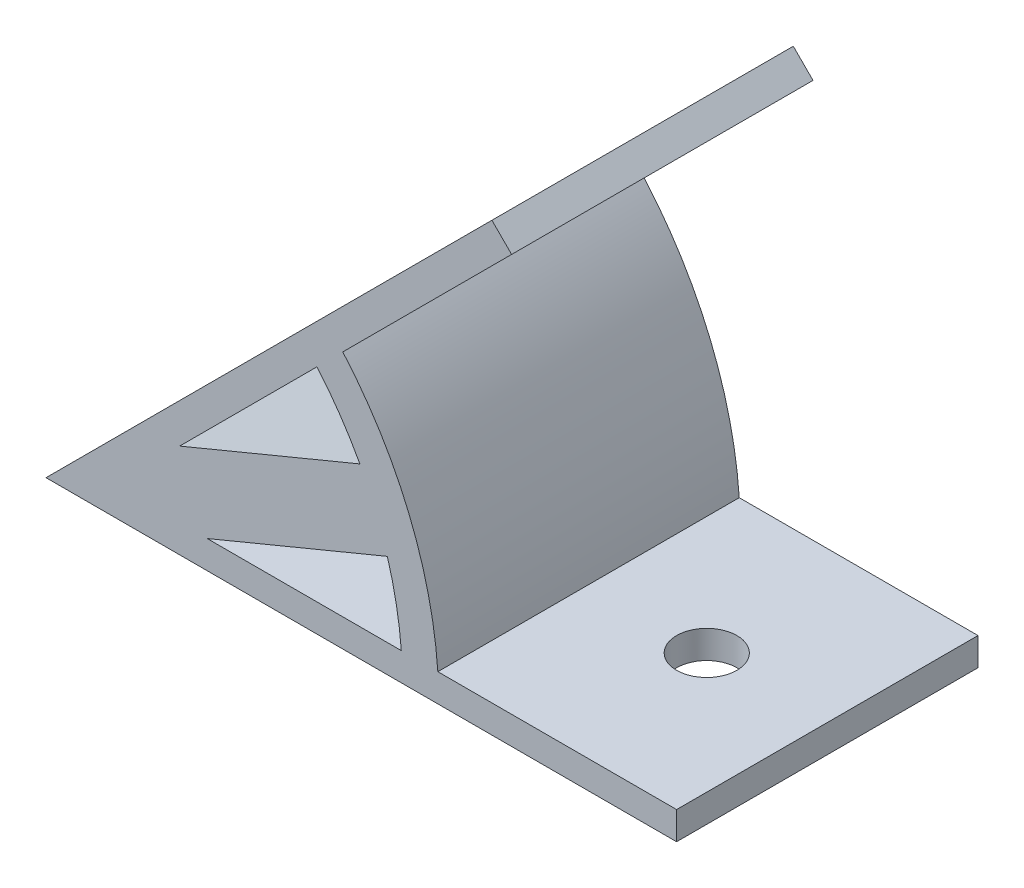
ISO-10303-21;
HEADER;
FILE_DESCRIPTION(('STEP AP214'),'2;1');
FILE_NAME('part.step','',(''),(''),'','','');
FILE_SCHEMA(('AUTOMOTIVE_DESIGN { 1 0 10303 214 1 1 1 1 }'));
ENDSEC;
DATA;
#1=APPLICATION_CONTEXT('core data for automotive mechanical design processes');
#2=APPLICATION_PROTOCOL_DEFINITION('international standard','automotive_design',2000,#1);
#3=PRODUCT_CONTEXT('',#1,'mechanical');
#4=PRODUCT('Part','Part','',(#3));
#5=PRODUCT_RELATED_PRODUCT_CATEGORY('part','',(#4));
#6=PRODUCT_DEFINITION_FORMATION('','',#4);
#7=PRODUCT_DEFINITION_CONTEXT('part definition',#1,'design');
#8=PRODUCT_DEFINITION('design','',#6,#7);
#9=PRODUCT_DEFINITION_SHAPE('','',#8);
#10=(LENGTH_UNIT() NAMED_UNIT(*) SI_UNIT(.MILLI.,.METRE.));
#11=(NAMED_UNIT(*) PLANE_ANGLE_UNIT() SI_UNIT($,.RADIAN.));
#12=(NAMED_UNIT(*) SI_UNIT($,.STERADIAN.) SOLID_ANGLE_UNIT());
#13=UNCERTAINTY_MEASURE_WITH_UNIT(LENGTH_MEASURE(1.E-05),#10,'distance_accuracy_value','');
#14=(GEOMETRIC_REPRESENTATION_CONTEXT(3) GLOBAL_UNCERTAINTY_ASSIGNED_CONTEXT((#13)) GLOBAL_UNIT_ASSIGNED_CONTEXT((#10,
#11,#12)) REPRESENTATION_CONTEXT('',''));
#15=CARTESIAN_POINT('',(0.,0.,0.));
#16=DIRECTION('',(0.,0.,1.));
#17=DIRECTION('',(1.,0.,0.));
#18=AXIS2_PLACEMENT_3D('',#15,#16,#17);
#19=CARTESIAN_POINT('',(0.,0.,25.));
#20=DIRECTION('',(0.,0.,1.));
#21=DIRECTION('',(1.,0.,0.));
#22=AXIS2_PLACEMENT_3D('',#19,#20,#21);
#23=PLANE('',#22);
#24=DIRECTION('',(-0.707106781186547,-0.707106781186548,0.));
#25=VECTOR('',#24,1.);
#26=CARTESIAN_POINT('',(0.,0.,25.));
#27=LINE('',#26,#25);
#28=CARTESIAN_POINT('',(36.9856111019384,36.9856111019385,25.));
#29=VERTEX_POINT('',#28);
#30=CARTESIAN_POINT('',(0.,0.,25.));
#31=VERTEX_POINT('',#30);
#32=EDGE_CURVE('E183',#29,#31,#27,.T.);
#33=ORIENTED_EDGE('',*,*,#32,.T.);
#34=DIRECTION('',(1.,0.,0.));
#35=VECTOR('',#34,1.);
#36=CARTESIAN_POINT('',(0.,0.,25.));
#37=LINE('',#36,#35);
#38=CARTESIAN_POINT('',(52.3055528330183,0.,25.));
#39=VERTEX_POINT('',#38);
#40=EDGE_CURVE('E186',#31,#39,#37,.T.);
#41=ORIENTED_EDGE('',*,*,#40,.T.);
#42=DIRECTION('',(0.,1.,0.));
#43=VECTOR('',#42,1.);
#44=CARTESIAN_POINT('',(52.3055528330183,0.,25.));
#45=LINE('',#44,#43);
#46=CARTESIAN_POINT('',(52.3055528330183,2.31452320854952,25.));
#47=VERTEX_POINT('',#46);
#48=EDGE_CURVE('E189',#39,#47,#45,.T.);
#49=ORIENTED_EDGE('',*,*,#48,.T.);
#50=DIRECTION('',(-1.,0.,0.));
#51=VECTOR('',#50,1.);
#52=CARTESIAN_POINT('',(52.3055528330183,2.31452320854952,25.));
#53=LINE('',#52,#51);
#54=CARTESIAN_POINT('',(32.5014490935283,2.31452320854952,25.));
#55=VERTEX_POINT('',#54);
#56=EDGE_CURVE('E191',#47,#55,#53,.T.);
#57=ORIENTED_EDGE('',*,*,#56,.T.);
#58=CARTESIAN_POINT('',(0.,0.,25.));
#59=DIRECTION('',(0.,0.,1.));
#60=DIRECTION('',(1.,0.,0.));
#61=AXIS2_PLACEMENT_3D('',#58,#59,#60);
#62=CIRCLE('',#61,32.5837568561719);
#63=CARTESIAN_POINT('',(24.6186101084022,21.3453799964443,25.));
#64=VERTEX_POINT('',#63);
#65=EDGE_CURVE('E193',#55,#64,#62,.T.);
#66=ORIENTED_EDGE('',*,*,#65,.T.);
#67=DIRECTION('',(0.707106781186547,0.707106781186548,0.));
#68=VECTOR('',#67,1.);
#69=CARTESIAN_POINT('',(38.6222261579174,35.3489960459595,25.));
#70=LINE('',#69,#68);
#71=CARTESIAN_POINT('',(38.6222261579174,35.3489960459595,25.));
#72=VERTEX_POINT('',#71);
#73=EDGE_CURVE('E195',#64,#72,#70,.T.);
#74=ORIENTED_EDGE('',*,*,#73,.T.);
#75=DIRECTION('',(-0.707106781186549,0.707106781186546,0.));
#76=VECTOR('',#75,1.);
#77=CARTESIAN_POINT('',(36.9856111019384,36.9856111019385,25.));
#78=LINE('',#77,#76);
#79=EDGE_CURVE('E197',#72,#29,#78,.T.);
#80=ORIENTED_EDGE('',*,*,#79,.T.);
#81=EDGE_LOOP('',(#33,#41,#49,#57,#66,#74,#80));
#82=FACE_BOUND('',#81,.T.);
#83=DIRECTION('',(0.923879532511287,0.38268343236509,0.));
#84=VECTOR('',#83,1.);
#85=CARTESIAN_POINT('',(11.0897214732478,7.8164913612898,25.));
#86=LINE('',#85,#84);
#87=CARTESIAN_POINT('',(11.0897214732478,7.8164913612898,25.));
#88=VERTEX_POINT('',#87);
#89=CARTESIAN_POINT('',(26.0330794630544,14.006232908064,25.));
#90=VERTEX_POINT('',#89);
#91=EDGE_CURVE('E161',#88,#90,#86,.T.);
#92=ORIENTED_EDGE('',*,*,#91,.F.);
#93=DIRECTION('',(-0.707106781186547,-0.707106781186548,0.));
#94=VECTOR('',#93,1.);
#95=CARTESIAN_POINT('',(22.4757461429716,19.2025160310136,25.));
#96=LINE('',#95,#94);
#97=CARTESIAN_POINT('',(22.4757461429716,19.2025160310136,25.));
#98=VERTEX_POINT('',#97);
#99=EDGE_CURVE('E159',#98,#88,#96,.T.);
#100=ORIENTED_EDGE('',*,*,#99,.F.);
#101=CARTESIAN_POINT('',(0.,0.,25.));
#102=DIRECTION('',(0.,0.,1.));
#103=DIRECTION('',(-1.,0.,0.));
#104=AXIS2_PLACEMENT_3D('',#101,#102,#103);
#105=CIRCLE('',#104,29.5617284103051);
#106=EDGE_CURVE('E165',#90,#98,#105,.T.);
#107=ORIENTED_EDGE('',*,*,#106,.F.);
#108=EDGE_LOOP('',(#92,#100,#107));
#109=FACE_BOUND('',#108,.T.);
#110=DIRECTION('',(-0.923879532511287,-0.38268343236509,0.));
#111=VECTOR('',#110,1.);
#112=CARTESIAN_POINT('',(13.3687113018577,2.31452320854952,25.));
#113=LINE('',#112,#111);
#114=CARTESIAN_POINT('',(28.3120692916643,8.50426475532377,25.));
#115=VERTEX_POINT('',#114);
#116=CARTESIAN_POINT('',(13.3687113018577,2.31452320854952,25.));
#117=VERTEX_POINT('',#116);
#118=EDGE_CURVE('E138',#115,#117,#113,.T.);
#119=ORIENTED_EDGE('',*,*,#118,.F.);
#120=CARTESIAN_POINT('',(0.,0.,25.));
#121=DIRECTION('',(0.,0.,1.));
#122=DIRECTION('',(1.,0.,0.));
#123=AXIS2_PLACEMENT_3D('',#120,#121,#122);
#124=CIRCLE('',#123,29.5617284103051);
#125=CARTESIAN_POINT('',(29.4709818112958,2.31452320854952,25.));
#126=VERTEX_POINT('',#125);
#127=EDGE_CURVE('E130',#126,#115,#124,.T.);
#128=ORIENTED_EDGE('',*,*,#127,.F.);
#129=DIRECTION('',(1.,0.,0.));
#130=VECTOR('',#129,1.);
#131=CARTESIAN_POINT('',(29.4709818112958,2.31452320854952,25.));
#132=LINE('',#131,#130);
#133=EDGE_CURVE('E147',#117,#126,#132,.T.);
#134=ORIENTED_EDGE('',*,*,#133,.F.);
#135=EDGE_LOOP('',(#119,#128,#134));
#136=FACE_BOUND('',#135,.T.);
#137=ADVANCED_FACE('F33',(#82,#109,#136),#23,.T.);
#138=CARTESIAN_POINT('',(0.,0.,0.));
#139=DIRECTION('',(0.,0.,1.));
#140=DIRECTION('',(1.,0.,0.));
#141=AXIS2_PLACEMENT_3D('',#138,#139,#140);
#142=PLANE('',#141);
#143=DIRECTION('',(-0.707106781186547,-0.707106781186548,0.));
#144=VECTOR('',#143,1.);
#145=CARTESIAN_POINT('',(22.4757461429716,19.2025160310136,0.));
#146=LINE('',#145,#144);
#147=CARTESIAN_POINT('',(22.4757461429716,19.2025160310136,0.));
#148=VERTEX_POINT('',#147);
#149=CARTESIAN_POINT('',(11.0897214732478,7.8164913612898,0.));
#150=VERTEX_POINT('',#149);
#151=EDGE_CURVE('E145',#148,#150,#146,.T.);
#152=ORIENTED_EDGE('',*,*,#151,.T.);
#153=DIRECTION('',(0.923879532511287,0.38268343236509,0.));
#154=VECTOR('',#153,1.);
#155=CARTESIAN_POINT('',(11.0897214732478,7.8164913612898,0.));
#156=LINE('',#155,#154);
#157=CARTESIAN_POINT('',(26.0330794630544,14.006232908064,0.));
#158=VERTEX_POINT('',#157);
#159=EDGE_CURVE('E170',#150,#158,#156,.T.);
#160=ORIENTED_EDGE('',*,*,#159,.T.);
#161=CARTESIAN_POINT('',(0.,0.,0.));
#162=DIRECTION('',(0.,0.,1.));
#163=DIRECTION('',(-1.,0.,0.));
#164=AXIS2_PLACEMENT_3D('',#161,#162,#163);
#165=CIRCLE('',#164,29.5617284103051);
#166=EDGE_CURVE('E162',#158,#148,#165,.T.);
#167=ORIENTED_EDGE('',*,*,#166,.T.);
#168=EDGE_LOOP('',(#152,#160,#167));
#169=FACE_BOUND('',#168,.T.);
#170=DIRECTION('',(-0.707106781186547,-0.707106781186548,0.));
#171=VECTOR('',#170,1.);
#172=CARTESIAN_POINT('',(0.,0.,0.));
#173=LINE('',#172,#171);
#174=CARTESIAN_POINT('',(36.9856111019384,36.9856111019385,0.));
#175=VERTEX_POINT('',#174);
#176=CARTESIAN_POINT('',(0.,0.,0.));
#177=VERTEX_POINT('',#176);
#178=EDGE_CURVE('E182',#175,#177,#173,.T.);
#179=ORIENTED_EDGE('',*,*,#178,.F.);
#180=DIRECTION('',(-0.707106781186549,0.707106781186546,0.));
#181=VECTOR('',#180,1.);
#182=CARTESIAN_POINT('',(36.9856111019384,36.9856111019385,0.));
#183=LINE('',#182,#181);
#184=CARTESIAN_POINT('',(38.6222261579174,35.3489960459595,0.));
#185=VERTEX_POINT('',#184);
#186=EDGE_CURVE('E187',#185,#175,#183,.T.);
#187=ORIENTED_EDGE('',*,*,#186,.F.);
#188=DIRECTION('',(0.707106781186547,0.707106781186548,0.));
#189=VECTOR('',#188,1.);
#190=CARTESIAN_POINT('',(38.6222261579174,35.3489960459595,0.));
#191=LINE('',#190,#189);
#192=CARTESIAN_POINT('',(24.6186101084022,21.3453799964443,0.));
#193=VERTEX_POINT('',#192);
#194=EDGE_CURVE('E210',#193,#185,#191,.T.);
#195=ORIENTED_EDGE('',*,*,#194,.F.);
#196=CARTESIAN_POINT('',(0.,0.,0.));
#197=DIRECTION('',(0.,0.,1.));
#198=DIRECTION('',(1.,0.,0.));
#199=AXIS2_PLACEMENT_3D('',#196,#197,#198);
#200=CIRCLE('',#199,32.5837568561719);
#201=CARTESIAN_POINT('',(32.5014490935283,2.31452320854952,0.));
#202=VERTEX_POINT('',#201);
#203=EDGE_CURVE('E208',#202,#193,#200,.T.);
#204=ORIENTED_EDGE('',*,*,#203,.F.);
#205=DIRECTION('',(-1.,0.,0.));
#206=VECTOR('',#205,1.);
#207=CARTESIAN_POINT('',(52.3055528330183,2.31452320854952,0.));
#208=LINE('',#207,#206);
#209=CARTESIAN_POINT('',(52.3055528330183,2.31452320854952,0.));
#210=VERTEX_POINT('',#209);
#211=EDGE_CURVE('E206',#210,#202,#208,.T.);
#212=ORIENTED_EDGE('',*,*,#211,.F.);
#213=DIRECTION('',(0.,1.,0.));
#214=VECTOR('',#213,1.);
#215=CARTESIAN_POINT('',(52.3055528330183,0.,0.));
#216=LINE('',#215,#214);
#217=CARTESIAN_POINT('',(52.3055528330183,0.,0.));
#218=VERTEX_POINT('',#217);
#219=EDGE_CURVE('E204',#218,#210,#216,.T.);
#220=ORIENTED_EDGE('',*,*,#219,.F.);
#221=DIRECTION('',(1.,0.,0.));
#222=VECTOR('',#221,1.);
#223=CARTESIAN_POINT('',(0.,0.,0.));
#224=LINE('',#223,#222);
#225=EDGE_CURVE('E202',#177,#218,#224,.T.);
#226=ORIENTED_EDGE('',*,*,#225,.F.);
#227=EDGE_LOOP('',(#179,#187,#195,#204,#212,#220,#226));
#228=FACE_BOUND('',#227,.T.);
#229=CARTESIAN_POINT('',(0.,0.,0.));
#230=DIRECTION('',(0.,0.,1.));
#231=DIRECTION('',(1.,0.,0.));
#232=AXIS2_PLACEMENT_3D('',#229,#230,#231);
#233=CIRCLE('',#232,29.5617284103051);
#234=CARTESIAN_POINT('',(29.4709818112958,2.31452320854952,0.));
#235=VERTEX_POINT('',#234);
#236=CARTESIAN_POINT('',(28.3120692916643,8.50426475532377,0.));
#237=VERTEX_POINT('',#236);
#238=EDGE_CURVE('E58',#235,#237,#233,.T.);
#239=ORIENTED_EDGE('',*,*,#238,.T.);
#240=DIRECTION('',(-0.923879532511287,-0.38268343236509,0.));
#241=VECTOR('',#240,1.);
#242=CARTESIAN_POINT('',(13.3687113018577,2.31452320854952,0.));
#243=LINE('',#242,#241);
#244=CARTESIAN_POINT('',(13.3687113018577,2.31452320854952,0.));
#245=VERTEX_POINT('',#244);
#246=EDGE_CURVE('E144',#237,#245,#243,.T.);
#247=ORIENTED_EDGE('',*,*,#246,.T.);
#248=DIRECTION('',(1.,0.,0.));
#249=VECTOR('',#248,1.);
#250=CARTESIAN_POINT('',(29.4709818112958,2.31452320854952,0.));
#251=LINE('',#250,#249);
#252=EDGE_CURVE('E139',#245,#235,#251,.T.);
#253=ORIENTED_EDGE('',*,*,#252,.T.);
#254=EDGE_LOOP('',(#239,#247,#253));
#255=FACE_BOUND('',#254,.T.);
#256=ADVANCED_FACE('F247',(#169,#228,#255),#142,.F.);
#257=CARTESIAN_POINT('',(0.,0.,25.));
#258=DIRECTION('',(0.707106781186548,-0.707106781186547,0.));
#259=DIRECTION('',(0.707106781186547,0.707106781186548,0.));
#260=AXIS2_PLACEMENT_3D('',#257,#258,#259);
#261=PLANE('',#260);
#262=CARTESIAN_POINT('',(29.914543290073,29.914543290073,12.5));
#263=DIRECTION('',(-0.707106781186548,0.707106781186547,0.));
#264=DIRECTION('',(-0.707106781186547,-0.707106781186548,0.));
#265=AXIS2_PLACEMENT_3D('',#262,#263,#264);
#266=CIRCLE('',#265,2.5);
#267=CARTESIAN_POINT('',(28.1467763371066,28.1467763371066,12.5));
#268=VERTEX_POINT('',#267);
#269=EDGE_CURVE('E236',#268,#268,#266,.T.);
#270=ORIENTED_EDGE('',*,*,#269,.F.);
#271=EDGE_LOOP('',(#270));
#272=FACE_BOUND('',#271,.T.);
#273=ORIENTED_EDGE('',*,*,#178,.T.);
#274=DIRECTION('',(0.,0.,-1.));
#275=VECTOR('',#274,1.);
#276=CARTESIAN_POINT('',(0.,0.,25.));
#277=LINE('',#276,#275);
#278=EDGE_CURVE('E11',#31,#177,#277,.T.);
#279=ORIENTED_EDGE('',*,*,#278,.F.);
#280=ORIENTED_EDGE('',*,*,#32,.F.);
#281=DIRECTION('',(0.,0.,-1.));
#282=VECTOR('',#281,1.);
#283=CARTESIAN_POINT('',(36.9856111019384,36.9856111019385,25.));
#284=LINE('',#283,#282);
#285=EDGE_CURVE('E199',#29,#175,#284,.T.);
#286=ORIENTED_EDGE('',*,*,#285,.T.);
#287=EDGE_LOOP('',(#273,#279,#280,#286));
#288=FACE_BOUND('',#287,.T.);
#289=ADVANCED_FACE('F35',(#272,#288),#261,.F.);
#290=CARTESIAN_POINT('',(0.,0.,25.));
#291=DIRECTION('',(0.,1.,0.));
#292=DIRECTION('',(-1.,0.,0.));
#293=AXIS2_PLACEMENT_3D('',#290,#291,#292);
#294=PLANE('',#293);
#295=CARTESIAN_POINT('',(42.3055528330183,0.,12.5));
#296=DIRECTION('',(0.,-1.,0.));
#297=DIRECTION('',(1.,0.,0.));
#298=AXIS2_PLACEMENT_3D('',#295,#296,#297);
#299=CIRCLE('',#298,2.5);
#300=CARTESIAN_POINT('',(44.8055528330183,0.,12.5));
#301=VERTEX_POINT('',#300);
#302=EDGE_CURVE('E229',#301,#301,#299,.T.);
#303=ORIENTED_EDGE('',*,*,#302,.F.);
#304=EDGE_LOOP('',(#303));
#305=FACE_BOUND('',#304,.T.);
#306=ORIENTED_EDGE('',*,*,#225,.T.);
#307=DIRECTION('',(0.,0.,-1.));
#308=VECTOR('',#307,1.);
#309=CARTESIAN_POINT('',(52.3055528330183,0.,25.));
#310=LINE('',#309,#308);
#311=EDGE_CURVE('E42',#39,#218,#310,.T.);
#312=ORIENTED_EDGE('',*,*,#311,.F.);
#313=ORIENTED_EDGE('',*,*,#40,.F.);
#314=ORIENTED_EDGE('',*,*,#278,.T.);
#315=EDGE_LOOP('',(#306,#312,#313,#314));
#316=FACE_BOUND('',#315,.T.);
#317=ADVANCED_FACE('F246',(#305,#316),#294,.F.);
#318=CARTESIAN_POINT('',(52.3055528330183,0.,25.));
#319=DIRECTION('',(-1.,0.,0.));
#320=DIRECTION('',(0.,0.,1.));
#321=AXIS2_PLACEMENT_3D('',#318,#319,#320);
#322=PLANE('',#321);
#323=ORIENTED_EDGE('',*,*,#219,.T.);
#324=DIRECTION('',(0.,0.,-1.));
#325=VECTOR('',#324,1.);
#326=CARTESIAN_POINT('',(52.3055528330183,2.31452320854952,25.));
#327=LINE('',#326,#325);
#328=EDGE_CURVE('E224',#47,#210,#327,.T.);
#329=ORIENTED_EDGE('',*,*,#328,.F.);
#330=ORIENTED_EDGE('',*,*,#48,.F.);
#331=ORIENTED_EDGE('',*,*,#311,.T.);
#332=EDGE_LOOP('',(#323,#329,#330,#331));
#333=FACE_BOUND('',#332,.T.);
#334=ADVANCED_FACE('F281',(#333),#322,.F.);
#335=CARTESIAN_POINT('',(52.3055528330183,2.31452320854952,25.));
#336=DIRECTION('',(0.,-1.,0.));
#337=DIRECTION('',(0.,0.,-1.));
#338=AXIS2_PLACEMENT_3D('',#335,#336,#337);
#339=PLANE('',#338);
#340=CARTESIAN_POINT('',(42.3055528330183,2.31452320854952,12.5));
#341=DIRECTION('',(0.,-1.,0.));
#342=DIRECTION('',(0.,0.,-1.));
#343=AXIS2_PLACEMENT_3D('',#340,#341,#342);
#344=CIRCLE('',#343,2.5);
#345=CARTESIAN_POINT('',(42.3055528330183,2.31452320854952,10.));
#346=VERTEX_POINT('',#345);
#347=EDGE_CURVE('E153',#346,#346,#344,.T.);
#348=ORIENTED_EDGE('',*,*,#347,.T.);
#349=EDGE_LOOP('',(#348));
#350=FACE_BOUND('',#349,.T.);
#351=ORIENTED_EDGE('',*,*,#211,.T.);
#352=DIRECTION('',(0.,0.,-1.));
#353=VECTOR('',#352,1.);
#354=CARTESIAN_POINT('',(32.5014490935283,2.31452320854952,25.));
#355=LINE('',#354,#353);
#356=EDGE_CURVE('E221',#55,#202,#355,.T.);
#357=ORIENTED_EDGE('',*,*,#356,.F.);
#358=ORIENTED_EDGE('',*,*,#56,.F.);
#359=ORIENTED_EDGE('',*,*,#328,.T.);
#360=EDGE_LOOP('',(#351,#357,#358,#359));
#361=FACE_BOUND('',#360,.T.);
#362=ADVANCED_FACE('F278',(#350,#361),#339,.F.);
#363=CARTESIAN_POINT('',(0.,0.,25.));
#364=DIRECTION('',(0.,0.,-1.));
#365=DIRECTION('',(-1.,0.,0.));
#366=AXIS2_PLACEMENT_3D('',#363,#364,#365);
#367=CYLINDRICAL_SURFACE('',#366,32.5837568561719);
#368=ORIENTED_EDGE('',*,*,#203,.T.);
#369=DIRECTION('',(0.,0.,-1.));
#370=VECTOR('',#369,1.);
#371=CARTESIAN_POINT('',(24.6186101084022,21.3453799964443,25.));
#372=LINE('',#371,#370);
#373=EDGE_CURVE('E218',#64,#193,#372,.T.);
#374=ORIENTED_EDGE('',*,*,#373,.F.);
#375=ORIENTED_EDGE('',*,*,#65,.F.);
#376=ORIENTED_EDGE('',*,*,#356,.T.);
#377=EDGE_LOOP('',(#368,#374,#375,#376));
#378=FACE_BOUND('',#377,.T.);
#379=ADVANCED_FACE('F273',(#378),#367,.T.);
#380=CARTESIAN_POINT('',(38.6222261579174,35.3489960459595,25.));
#381=DIRECTION('',(-0.707106781186548,0.707106781186547,0.));
#382=DIRECTION('',(-0.707106781186547,-0.707106781186548,0.));
#383=AXIS2_PLACEMENT_3D('',#380,#381,#382);
#384=PLANE('',#383);
#385=CARTESIAN_POINT('',(31.551158346052,28.277928234094,12.5));
#386=DIRECTION('',(-0.707106781186548,0.707106781186547,0.));
#387=DIRECTION('',(-0.707106781186547,-0.707106781186548,0.));
#388=AXIS2_PLACEMENT_3D('',#385,#386,#387);
#389=CIRCLE('',#388,2.5);
#390=CARTESIAN_POINT('',(29.7833913930856,26.5101612811276,12.5));
#391=VERTEX_POINT('',#390);
#392=EDGE_CURVE('E37',#391,#391,#389,.T.);
#393=ORIENTED_EDGE('',*,*,#392,.T.);
#394=EDGE_LOOP('',(#393));
#395=FACE_BOUND('',#394,.T.);
#396=ORIENTED_EDGE('',*,*,#194,.T.);
#397=DIRECTION('',(0.,0.,-1.));
#398=VECTOR('',#397,1.);
#399=CARTESIAN_POINT('',(38.6222261579174,35.3489960459595,25.));
#400=LINE('',#399,#398);
#401=EDGE_CURVE('E215',#72,#185,#400,.T.);
#402=ORIENTED_EDGE('',*,*,#401,.F.);
#403=ORIENTED_EDGE('',*,*,#73,.F.);
#404=ORIENTED_EDGE('',*,*,#373,.T.);
#405=EDGE_LOOP('',(#396,#402,#403,#404));
#406=FACE_BOUND('',#405,.T.);
#407=ADVANCED_FACE('F269',(#395,#406),#384,.F.);
#408=CARTESIAN_POINT('',(36.9856111019384,36.9856111019385,25.));
#409=DIRECTION('',(-0.707106781186546,-0.707106781186549,0.));
#410=DIRECTION('',(0.707106781186549,-0.707106781186546,0.));
#411=AXIS2_PLACEMENT_3D('',#408,#409,#410);
#412=PLANE('',#411);
#413=ORIENTED_EDGE('',*,*,#186,.T.);
#414=ORIENTED_EDGE('',*,*,#285,.F.);
#415=ORIENTED_EDGE('',*,*,#79,.F.);
#416=ORIENTED_EDGE('',*,*,#401,.T.);
#417=EDGE_LOOP('',(#413,#414,#415,#416));
#418=FACE_BOUND('',#417,.T.);
#419=ADVANCED_FACE('F267',(#418),#412,.F.);
#420=CARTESIAN_POINT('',(22.4757461429716,19.2025160310136,25.));
#421=DIRECTION('',(0.707106781186548,-0.707106781186547,0.));
#422=DIRECTION('',(0.707106781186547,0.707106781186548,0.));
#423=AXIS2_PLACEMENT_3D('',#420,#421,#422);
#424=PLANE('',#423);
#425=ORIENTED_EDGE('',*,*,#151,.F.);
#426=DIRECTION('',(0.,0.,-1.));
#427=VECTOR('',#426,1.);
#428=CARTESIAN_POINT('',(22.4757461429716,19.2025160310136,25.));
#429=LINE('',#428,#427);
#430=EDGE_CURVE('E167',#98,#148,#429,.T.);
#431=ORIENTED_EDGE('',*,*,#430,.F.);
#432=ORIENTED_EDGE('',*,*,#99,.T.);
#433=DIRECTION('',(0.,0.,-1.));
#434=VECTOR('',#433,1.);
#435=CARTESIAN_POINT('',(11.0897214732478,7.8164913612898,25.));
#436=LINE('',#435,#434);
#437=EDGE_CURVE('E179',#88,#150,#436,.T.);
#438=ORIENTED_EDGE('',*,*,#437,.T.);
#439=EDGE_LOOP('',(#425,#431,#432,#438));
#440=FACE_BOUND('',#439,.T.);
#441=ADVANCED_FACE('F298',(#440),#424,.T.);
#442=CARTESIAN_POINT('',(11.0897214732478,7.8164913612898,25.));
#443=DIRECTION('',(-0.38268343236509,0.923879532511287,0.));
#444=DIRECTION('',(-0.923879532511287,-0.38268343236509,0.));
#445=AXIS2_PLACEMENT_3D('',#442,#443,#444);
#446=PLANE('',#445);
#447=ORIENTED_EDGE('',*,*,#159,.F.);
#448=ORIENTED_EDGE('',*,*,#437,.F.);
#449=ORIENTED_EDGE('',*,*,#91,.T.);
#450=DIRECTION('',(0.,0.,-1.));
#451=VECTOR('',#450,1.);
#452=CARTESIAN_POINT('',(26.0330794630544,14.006232908064,25.));
#453=LINE('',#452,#451);
#454=EDGE_CURVE('E177',#90,#158,#453,.T.);
#455=ORIENTED_EDGE('',*,*,#454,.T.);
#456=EDGE_LOOP('',(#447,#448,#449,#455));
#457=FACE_BOUND('',#456,.T.);
#458=ADVANCED_FACE('F327',(#457),#446,.T.);
#459=CARTESIAN_POINT('',(0.,0.,25.));
#460=DIRECTION('',(0.,0.,-1.));
#461=DIRECTION('',(-1.,0.,0.));
#462=AXIS2_PLACEMENT_3D('',#459,#460,#461);
#463=CYLINDRICAL_SURFACE('',#462,29.5617284103051);
#464=ORIENTED_EDGE('',*,*,#166,.F.);
#465=ORIENTED_EDGE('',*,*,#454,.F.);
#466=ORIENTED_EDGE('',*,*,#106,.T.);
#467=ORIENTED_EDGE('',*,*,#430,.T.);
#468=EDGE_LOOP('',(#464,#465,#466,#467));
#469=FACE_BOUND('',#468,.T.);
#470=ADVANCED_FACE('F334',(#469),#463,.F.);
#471=CARTESIAN_POINT('',(0.,0.,25.));
#472=DIRECTION('',(0.,0.,-1.));
#473=DIRECTION('',(-1.,0.,0.));
#474=AXIS2_PLACEMENT_3D('',#471,#472,#473);
#475=CYLINDRICAL_SURFACE('',#474,29.5617284103051);
#476=ORIENTED_EDGE('',*,*,#238,.F.);
#477=DIRECTION('',(0.,0.,-1.));
#478=VECTOR('',#477,1.);
#479=CARTESIAN_POINT('',(29.4709818112958,2.31452320854952,25.));
#480=LINE('',#479,#478);
#481=EDGE_CURVE('E134',#126,#235,#480,.T.);
#482=ORIENTED_EDGE('',*,*,#481,.F.);
#483=ORIENTED_EDGE('',*,*,#127,.T.);
#484=DIRECTION('',(0.,0.,-1.));
#485=VECTOR('',#484,1.);
#486=CARTESIAN_POINT('',(28.3120692916643,8.50426475532377,25.));
#487=LINE('',#486,#485);
#488=EDGE_CURVE('E133',#115,#237,#487,.T.);
#489=ORIENTED_EDGE('',*,*,#488,.T.);
#490=EDGE_LOOP('',(#476,#482,#483,#489));
#491=FACE_BOUND('',#490,.T.);
#492=ADVANCED_FACE('F132',(#491),#475,.F.);
#493=CARTESIAN_POINT('',(13.3687113018577,2.31452320854952,25.));
#494=DIRECTION('',(0.38268343236509,-0.923879532511287,0.));
#495=DIRECTION('',(0.923879532511287,0.38268343236509,0.));
#496=AXIS2_PLACEMENT_3D('',#493,#494,#495);
#497=PLANE('',#496);
#498=ORIENTED_EDGE('',*,*,#246,.F.);
#499=ORIENTED_EDGE('',*,*,#488,.F.);
#500=ORIENTED_EDGE('',*,*,#118,.T.);
#501=DIRECTION('',(0.,0.,-1.));
#502=VECTOR('',#501,1.);
#503=CARTESIAN_POINT('',(13.3687113018577,2.31452320854952,25.));
#504=LINE('',#503,#502);
#505=EDGE_CURVE('E50',#117,#245,#504,.T.);
#506=ORIENTED_EDGE('',*,*,#505,.T.);
#507=EDGE_LOOP('',(#498,#499,#500,#506));
#508=FACE_BOUND('',#507,.T.);
#509=ADVANCED_FACE('F142',(#508),#497,.T.);
#510=CARTESIAN_POINT('',(29.4709818112958,2.31452320854952,25.));
#511=DIRECTION('',(0.,1.,0.));
#512=DIRECTION('',(0.,0.,1.));
#513=AXIS2_PLACEMENT_3D('',#510,#511,#512);
#514=PLANE('',#513);
#515=ORIENTED_EDGE('',*,*,#252,.F.);
#516=ORIENTED_EDGE('',*,*,#505,.F.);
#517=ORIENTED_EDGE('',*,*,#133,.T.);
#518=ORIENTED_EDGE('',*,*,#481,.T.);
#519=EDGE_LOOP('',(#515,#516,#517,#518));
#520=FACE_BOUND('',#519,.T.);
#521=ADVANCED_FACE('F354',(#520),#514,.T.);
#522=CARTESIAN_POINT('',(42.3055528330183,36.9856111019385,12.5));
#523=DIRECTION('',(0.,-1.,0.));
#524=DIRECTION('',(1.,0.,0.));
#525=AXIS2_PLACEMENT_3D('',#522,#523,#524);
#526=CYLINDRICAL_SURFACE('',#525,2.5);
#527=ORIENTED_EDGE('',*,*,#302,.T.);
#528=EDGE_LOOP('',(#527));
#529=FACE_BOUND('',#528,.T.);
#530=ORIENTED_EDGE('',*,*,#347,.F.);
#531=EDGE_LOOP('',(#530));
#532=FACE_BOUND('',#531,.T.);
#533=ADVANCED_FACE('F361',(#529,#532),#526,.F.);
#534=CARTESIAN_POINT('',(56.0673197065821,3.76176687356386,12.5));
#535=DIRECTION('',(-0.707106781186548,0.707106781186547,0.));
#536=DIRECTION('',(-0.707106781186547,-0.707106781186548,0.));
#537=AXIS2_PLACEMENT_3D('',#534,#535,#536);
#538=CYLINDRICAL_SURFACE('',#537,2.5);
#539=ORIENTED_EDGE('',*,*,#269,.T.);
#540=EDGE_LOOP('',(#539));
#541=FACE_BOUND('',#540,.T.);
#542=ORIENTED_EDGE('',*,*,#392,.F.);
#543=EDGE_LOOP('',(#542));
#544=FACE_BOUND('',#543,.T.);
#545=ADVANCED_FACE('F241',(#541,#544),#538,.F.);
#546=CLOSED_SHELL('',(#137,#256,#289,#317,#334,#362,#379,#407,#419,#441,#458,#470,#492,#509,
#521,#533,#545));
#547=MANIFOLD_SOLID_BREP('B2',#546);
#548=ADVANCED_BREP_SHAPE_REPRESENTATION('',(#18,#547),#14);
#549=SHAPE_DEFINITION_REPRESENTATION(#9,#548);
ENDSEC;
END-ISO-10303-21;
